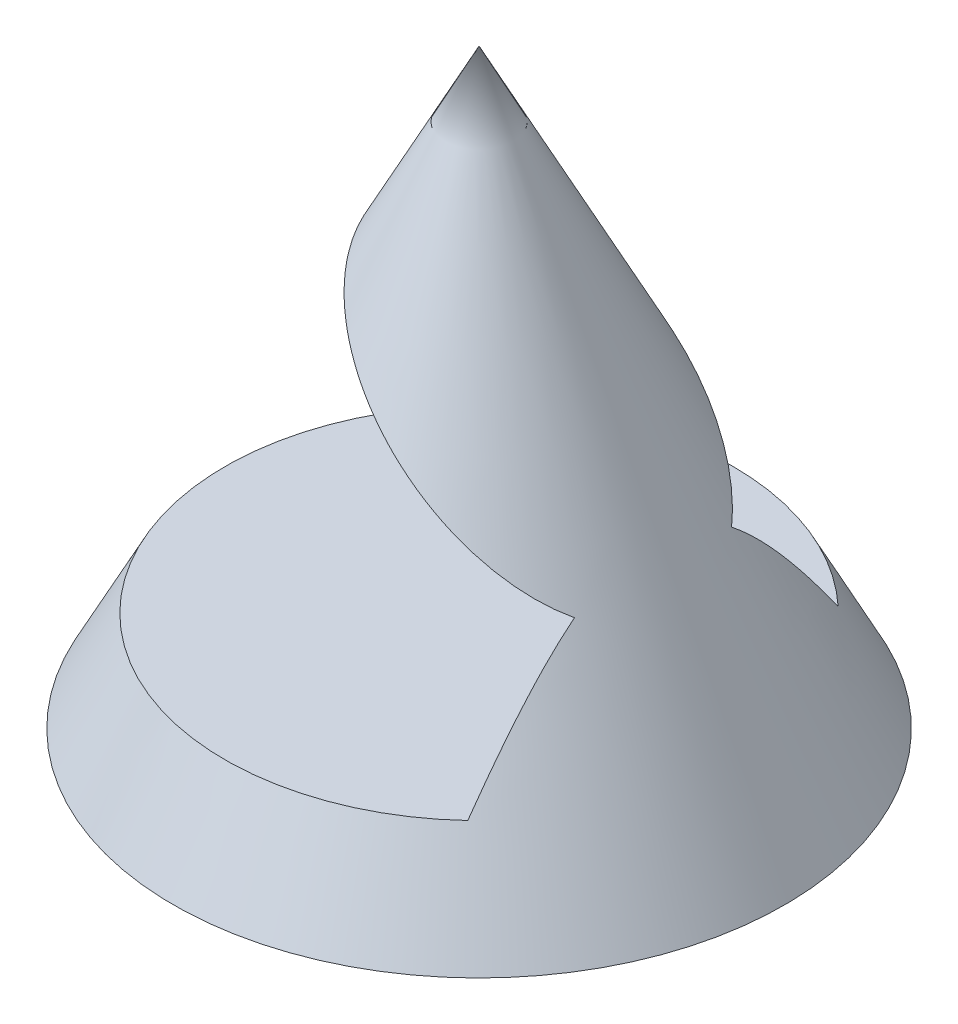
ISO-10303-21;
HEADER;
FILE_DESCRIPTION(('STEP AP214'),'2;1');
FILE_NAME('part.step','',(''),(''),'','','');
FILE_SCHEMA(('AUTOMOTIVE_DESIGN { 1 0 10303 214 1 1 1 1 }'));
ENDSEC;
DATA;
#1=APPLICATION_CONTEXT('core data for automotive mechanical design processes');
#2=APPLICATION_PROTOCOL_DEFINITION('international standard','automotive_design',2000,#1);
#3=PRODUCT_CONTEXT('',#1,'mechanical');
#4=PRODUCT('Part','Part','',(#3));
#5=PRODUCT_RELATED_PRODUCT_CATEGORY('part','',(#4));
#6=PRODUCT_DEFINITION_FORMATION('','',#4);
#7=PRODUCT_DEFINITION_CONTEXT('part definition',#1,'design');
#8=PRODUCT_DEFINITION('design','',#6,#7);
#9=PRODUCT_DEFINITION_SHAPE('','',#8);
#10=(LENGTH_UNIT() NAMED_UNIT(*) SI_UNIT(.MILLI.,.METRE.));
#11=(NAMED_UNIT(*) PLANE_ANGLE_UNIT() SI_UNIT($,.RADIAN.));
#12=(NAMED_UNIT(*) SI_UNIT($,.STERADIAN.) SOLID_ANGLE_UNIT());
#13=UNCERTAINTY_MEASURE_WITH_UNIT(LENGTH_MEASURE(1.E-05),#10,'distance_accuracy_value','');
#14=(GEOMETRIC_REPRESENTATION_CONTEXT(3) GLOBAL_UNCERTAINTY_ASSIGNED_CONTEXT((#13)) GLOBAL_UNIT_ASSIGNED_CONTEXT((#10,
#11,#12)) REPRESENTATION_CONTEXT('',''));
#15=CARTESIAN_POINT('',(0.,0.,0.));
#16=DIRECTION('',(0.,0.,1.));
#17=DIRECTION('',(1.,0.,0.));
#18=AXIS2_PLACEMENT_3D('',#15,#16,#17);
#19=CARTESIAN_POINT('',(0.,0.,0.));
#20=DIRECTION('',(0.,-1.,0.));
#21=DIRECTION('',(0.,0.,-1.));
#22=AXIS2_PLACEMENT_3D('',#19,#20,#21);
#23=CONICAL_SURFACE('',#22,15.,0.477345382373672);
#24=CARTESIAN_POINT('',(0.,29.,0.));
#25=VERTEX_POINT('',#24);
#26=VERTEX_LOOP('',#25);
#27=FACE_BOUND('',#26,.T.);
#28=CARTESIAN_POINT('',(0.,0.,0.));
#29=DIRECTION('',(0.,-1.,0.));
#30=DIRECTION('',(0.,0.,-1.));
#31=AXIS2_PLACEMENT_3D('',#28,#29,#30);
#32=CIRCLE('',#31,15.);
#33=CARTESIAN_POINT('',(0.,0.,-15.));
#34=VERTEX_POINT('',#33);
#35=EDGE_CURVE('E115',#34,#34,#32,.T.);
#36=ORIENTED_EDGE('',*,*,#35,.F.);
#37=EDGE_LOOP('',(#36));
#38=FACE_BOUND('',#37,.T.);
#39=CARTESIAN_POINT('',(8.53348056600441,-13.4586078213255,-20.2356258552981));
#40=CARTESIAN_POINT('',(8.53348056600441,-13.05966040621,-20.0116738064381));
#41=CARTESIAN_POINT('',(8.53348056600441,-12.6609508235194,-19.787298144297));
#42=CARTESIAN_POINT('',(8.53348056600441,-11.8640619759935,-19.3376052544349));
#43=CARTESIAN_POINT('',(8.53348056600441,-11.465882712237,-19.1122880248026));
#44=CARTESIAN_POINT('',(8.53348056600441,-10.2721845156053,-18.4347609725751));
#45=CARTESIAN_POINT('',(8.5334805660044,-9.47754558929341,-17.9809984468512));
#46=CARTESIAN_POINT('',(8.5334805660044,-7.88961301997016,-17.0674558174187));
#47=CARTESIAN_POINT('',(8.5334805660044,-7.09632525498491,-16.6076654853375));
#48=CARTESIAN_POINT('',(8.5334805660044,-5.51353644892241,-15.681656619156));
#49=CARTESIAN_POINT('',(8.5334805660044,-4.72403530070114,-15.2154382684031));
#50=CARTESIAN_POINT('',(8.5334805660044,-3.16196835312391,-14.2819322061547));
#51=CARTESIAN_POINT('',(8.5334805660044,-2.38932805184,-13.8147695558423));
#52=CARTESIAN_POINT('',(8.5334805660044,-1.2351740040714,-13.1061231452215));
#53=CARTESIAN_POINT('',(8.5334805660044,-0.85124022388794,-12.8685799486682));
#54=CARTESIAN_POINT('',(8.5334805660044,-0.0852816593075534,-12.3904374696865));
#55=CARTESIAN_POINT('',(8.5334805660044,0.296743137587599,-12.1498382073031));
#56=CARTESIAN_POINT('',(8.5334805660044,1.05820810948645,-11.6652788176243));
#57=CARTESIAN_POINT('',(8.5334805660044,1.4376501814203,-11.4213216743219));
#58=CARTESIAN_POINT('',(8.5334805660044,2.19380503358593,-10.9292188225121));
#59=CARTESIAN_POINT('',(8.5334805660044,2.57051785282622,-10.6810731740395));
#60=CARTESIAN_POINT('',(8.5334805660044,3.32056174189363,-10.1798258905106));
#61=CARTESIAN_POINT('',(8.5334805660044,3.69389326689394,-9.92672493746387));
#62=CARTESIAN_POINT('',(8.5334805660044,4.43641009709357,-9.41452302878426));
#63=CARTESIAN_POINT('',(8.53348056600439,4.80559557416044,-9.15542232323466));
#64=CARTESIAN_POINT('',(8.53348056600439,5.33266861810177,-8.77757461369057));
#65=CARTESIAN_POINT('',(8.53348056600439,5.49268573478393,-8.66179523927164));
#66=CARTESIAN_POINT('',(8.53348056600439,5.81158522097662,-8.42868380114913));
#67=CARTESIAN_POINT('',(8.53348056600439,5.97046758695118,-8.31135173261051));
#68=CARTESIAN_POINT('',(8.53348056600439,6.44525505395262,-7.95676969666214));
#69=CARTESIAN_POINT('',(8.53348056600439,6.75926153682737,-7.71696173032077));
#70=CARTESIAN_POINT('',(8.53348056600439,7.38361134521727,-7.2267795706655));
#71=CARTESIAN_POINT('',(8.53348056600439,7.6938944911596,-6.97632852997819));
#72=CARTESIAN_POINT('',(8.53348056600439,8.30563776989474,-6.4649332506073));
#73=CARTESIAN_POINT('',(8.53348056600439,8.60710013936827,-6.20399171254144));
#74=CARTESIAN_POINT('',(8.53348056600439,9.0525624565197,-5.80049783986084));
#75=CARTESIAN_POINT('',(8.53348056600439,9.20103917003653,-5.66288400355891));
#76=CARTESIAN_POINT('',(8.53348056600439,9.49427120958578,-5.38375441982924));
#77=CARTESIAN_POINT('',(8.53348056600439,9.63902679833706,-5.24223894933482));
#78=CARTESIAN_POINT('',(8.53348056600439,9.92429699600958,-4.95455299909006));
#79=CARTESIAN_POINT('',(8.53348056600439,10.0648047813167,-4.80837573200372));
#80=CARTESIAN_POINT('',(8.53348056600439,10.34035907064,-4.51097981488012));
#81=CARTESIAN_POINT('',(8.53348056600439,10.4754063664821,-4.35976190163131));
#82=CARTESIAN_POINT('',(8.53348056600439,10.7374149023442,-4.05320166853997));
#83=CARTESIAN_POINT('',(8.53348056600439,10.8644464418211,-3.89791972379306));
#84=CARTESIAN_POINT('',(8.53348056600439,11.1103964280339,-3.5809629871488));
#85=CARTESIAN_POINT('',(8.53348056600439,11.2293131339878,-3.41928683525196));
#86=CARTESIAN_POINT('',(8.53348056600439,11.4566139502929,-3.08931768564206));
#87=CARTESIAN_POINT('',(8.53348056600439,11.5650268855821,-2.92104468559996));
#88=CARTESIAN_POINT('',(8.53348056600439,11.7690069726093,-2.57694051182262));
#89=CARTESIAN_POINT('',(8.53348056600439,11.8645830789386,-2.40111472088106));
#90=CARTESIAN_POINT('',(8.53348056600439,12.015420972668,-2.09140505972893));
#91=CARTESIAN_POINT('',(8.53348056600439,12.0745170452163,-1.95939123812373));
#92=CARTESIAN_POINT('',(8.53348056600439,12.182910534608,-1.69135609469267));
#93=CARTESIAN_POINT('',(8.53348056600439,12.2322075876144,-1.55533462427831));
#94=CARTESIAN_POINT('',(8.53348056600439,12.3194611784987,-1.2799129055885));
#95=CARTESIAN_POINT('',(8.53348056600439,12.3574360430314,-1.14051851674717));
#96=CARTESIAN_POINT('',(8.53348056600439,12.4207832399538,-0.85890267800817));
#97=CARTESIAN_POINT('',(8.53348056600439,12.4461588603569,-0.716681975777813));
#98=CARTESIAN_POINT('',(8.53348056600439,12.4834506745952,-0.429037065900856));
#99=CARTESIAN_POINT('',(8.53348056600439,12.4952316370888,-0.283595096778628));
#100=CARTESIAN_POINT('',(8.53348056600439,12.5043337219175,0.00773953066816793));
#101=CARTESIAN_POINT('',(8.53348056600439,12.5016554423658,0.153632170101052));
#102=CARTESIAN_POINT('',(8.53348056600439,12.4819564693607,0.444587628268138));
#103=CARTESIAN_POINT('',(8.53348056600439,12.4649208689546,0.589649426686207));
#104=CARTESIAN_POINT('',(8.53348056600439,12.4172580787812,0.877513364382701));
#105=CARTESIAN_POINT('',(8.53348056600439,12.3866288147307,1.0203151553568));
#106=CARTESIAN_POINT('',(8.53348056600439,12.3071935449245,1.3249644684426));
#107=CARTESIAN_POINT('',(8.53348056600439,12.2562815584135,1.48626034366093));
#108=CARTESIAN_POINT('',(8.53348056600439,12.1401510747792,1.80363410360018));
#109=CARTESIAN_POINT('',(8.53348056600439,12.0749252225884,1.95970925800521));
#110=CARTESIAN_POINT('',(8.53348056600439,11.9323646156784,2.26650698458077));
#111=CARTESIAN_POINT('',(8.53348056600439,11.8550088574059,2.41721970543242));
#112=CARTESIAN_POINT('',(8.53348056600439,11.6903613198527,2.71305504360667));
#113=CARTESIAN_POINT('',(8.53348056600439,11.6030700477251,2.85817794575299));
#114=CARTESIAN_POINT('',(8.53348056600439,11.3983262448958,3.17743154261088));
#115=CARTESIAN_POINT('',(8.53348056600439,11.278669383785,3.35014293059723));
#116=CARTESIAN_POINT('',(8.53348056600439,11.0294298509937,3.68828506058596));
#117=CARTESIAN_POINT('',(8.53348056600439,10.8998431153841,3.85371277756848));
#118=CARTESIAN_POINT('',(8.53348056600439,10.632612901316,4.17832321892611));
#119=CARTESIAN_POINT('',(8.53348056600439,10.494957209249,4.33749583346204));
#120=CARTESIAN_POINT('',(8.53348056600439,10.2133124307284,4.65014279104208));
#121=CARTESIAN_POINT('',(8.53348056600439,10.0693225473338,4.80361641255779));
#122=CARTESIAN_POINT('',(8.53348056600439,9.77525070188436,5.10654939826336));
#123=CARTESIAN_POINT('',(8.53348056600439,9.62513505242564,5.25597593933596));
#124=CARTESIAN_POINT('',(8.53348056600439,9.32062658114464,5.55039949437481));
#125=CARTESIAN_POINT('',(8.53348056600439,9.16623364323636,5.69539638789501));
#126=CARTESIAN_POINT('',(8.53348056600439,8.85406007762875,5.98135104870962));
#127=CARTESIAN_POINT('',(8.53348056600439,8.69628320703577,6.12231292720447));
#128=CARTESIAN_POINT('',(8.53348056600439,8.37775106290222,6.4008092548294));
#129=CARTESIAN_POINT('',(8.53348056600439,8.21699589563691,6.53834382584781));
#130=CARTESIAN_POINT('',(8.53348056600439,7.70000814587899,6.9724125402845));
#131=CARTESIAN_POINT('',(8.53348056600439,7.33897657746886,7.26323717349352));
#132=CARTESIAN_POINT('',(8.53348056600439,6.60817893571383,7.83373402949235));
#133=CARTESIAN_POINT('',(8.53348056600439,6.23841129589615,8.11340422762878));
#134=CARTESIAN_POINT('',(8.53348056600439,5.49211777723225,8.66404117310498));
#135=CARTESIAN_POINT('',(8.53348056600439,5.1155878786556,8.93500245735227));
#136=CARTESIAN_POINT('',(8.53348056600439,4.35751806362202,9.46974535576851));
#137=CARTESIAN_POINT('',(8.5334805660044,3.97597848088894,9.73352744462377));
#138=CARTESIAN_POINT('',(8.5334805660044,3.20806639153807,10.2558078235198));
#139=CARTESIAN_POINT('',(8.5334805660044,2.82168502413415,10.5142930586568));
#140=CARTESIAN_POINT('',(8.5334805660044,2.04569649091231,11.0263786069552));
#141=CARTESIAN_POINT('',(8.5334805660044,1.6560892793762,11.2799788507142));
#142=CARTESIAN_POINT('',(8.5334805660044,0.874372119393789,11.7829869160319));
#143=CARTESIAN_POINT('',(8.5334805660044,0.482263085186727,12.0323961601992));
#144=CARTESIAN_POINT('',(8.5334805660044,-0.304152165765548,12.5277289356305));
#145=CARTESIAN_POINT('',(8.5334805660044,-0.698458400777123,12.7736524378555));
#146=CARTESIAN_POINT('',(8.5334805660044,-1.88297562510383,13.5062497671095));
#147=CARTESIAN_POINT('',(8.5334805660044,-2.67593267971954,13.9884842089968));
#148=CARTESIAN_POINT('',(8.5334805660044,-4.26723486726507,14.9440898328397));
#149=CARTESIAN_POINT('',(8.5334805660044,-5.06558041760688,15.4174603171883));
#150=CARTESIAN_POINT('',(8.5334805660044,-6.66549937403835,16.3568221592034));
#151=CARTESIAN_POINT('',(8.5334805660044,-7.4670686482032,16.8228205628501));
#152=CARTESIAN_POINT('',(8.5334805660044,-9.07334573825611,17.749374699948));
#153=CARTESIAN_POINT('',(8.53348056600441,-9.87805356140141,18.2099304208042));
#154=CARTESIAN_POINT('',(8.53348056600441,-10.9149052840259,18.799605001122));
#155=CARTESIAN_POINT('',(8.53348056600441,-11.145904940579,18.9307398482102));
#156=CARTESIAN_POINT('',(8.53348056600441,-11.6081210080959,19.1926813733562));
#157=CARTESIAN_POINT('',(8.53348056600441,-11.839337438511,19.3234880171074));
#158=CARTESIAN_POINT('',(8.53348056600441,-12.3018090082146,19.5846988115494));
#159=CARTESIAN_POINT('',(8.53348056600441,-12.5330640352391,19.7151031610486));
#160=CARTESIAN_POINT('',(8.53348056600441,-12.9957218549431,19.9755947009878));
#161=CARTESIAN_POINT('',(8.53348056600441,-13.2271246303149,20.105681922167));
#162=CARTESIAN_POINT('',(8.53348056600441,-13.4586078213255,20.2356258552981));
#163=B_SPLINE_CURVE_WITH_KNOTS('',3,(#39,#40,#41,#42,#43,#44,#45,#46,#47,#48,#49,#50,#51,#52,
#53,#54,#55,#56,#57,#58,#59,#60,#61,#62,#63,#64,#65,#66,#67,#68,#69,#70,#71,#72,#73,#74,#75,#76,
#77,#78,#79,#80,#81,#82,#83,#84,#85,#86,#87,#88,#89,#90,#91,#92,#93,#94,#95,#96,#97,#98,#99,
#100,#101,#102,#103,#104,#105,#106,#107,#108,#109,#110,#111,#112,#113,#114,#115,#116,#117,#118,
#119,#120,#121,#122,#123,#124,#125,#126,#127,#128,#129,#130,#131,#132,#133,#134,#135,#136,#137,
#138,#139,#140,#141,#142,#143,#144,#145,#146,#147,#148,#149,#150,#151,#152,#153,#154,#155,#156,
#157,#158,#159,#160,#161,#162),.UNSPECIFIED.,.F.,.F.,(4,2,2,2,2,2,2,2,2,2,2,2,2,2,2,2,2,2,2,2,2,
2,2,2,2,2,2,2,2,2,2,2,2,2,2,2,2,2,2,2,2,2,2,2,2,2,2,2,2,2,2,2,2,2,2,2,2,2,2,2,2,4),(0.,
1.37252350783083,2.74504980325729,5.49024138710343,8.24092875531117,10.9915378268912,
13.7001410444042,15.0545621619727,16.4089744004153,17.7622521348072,19.1155104888313,
20.4685838823033,21.8216009777668,22.4141237732038,23.006648414177,24.1918413758044,
25.3879256820968,26.5837040221691,27.1909742529683,27.798201490859,28.406357275193,
29.0144245522107,29.6160740867716,30.2178522831766,30.8179292731161,31.4175854686232,
31.8511690829802,32.2847687932621,32.7176627989774,33.1504437732747,33.5874936540923,
34.0245254562812,34.4620115806934,34.8995644849178,35.4061830519403,35.9130625530325,
36.4208296362881,36.9285708124517,37.558445342759,38.1885790484817,38.819692506524,
39.4508855969489,40.0862072731794,40.7215462090224,41.3562129376847,41.9908570628353,
43.381316511713,44.7720272063194,46.1635939092078,47.5550683774736,48.9496372743402,
50.3442259696505,51.7383313073044,53.1324482521542,55.9165963168925,58.7009625851177,
61.4824836910657,64.2640112325254,65.060889243172,65.8578473425788,66.6543128363991,
67.4506977878692),.UNSPECIFIED.);
#164=CARTESIAN_POINT('',(8.53348056600439,4.89806242760849,-9.08811400829762));
#165=VERTEX_POINT('',#164);
#166=CARTESIAN_POINT('',(8.53348056600439,10.8980624276085,-3.8531559716546));
#167=VERTEX_POINT('',#166);
#168=EDGE_CURVE('E12',#165,#167,#163,.T.);
#169=ORIENTED_EDGE('',*,*,#168,.T.);
#170=CARTESIAN_POINT('',(2.90363701409953,15.3863017727409,0.));
#171=DIRECTION('',(-0.623369997775086,-0.781927008021778,0.));
#172=DIRECTION('',(0.781927008021778,-0.623369997775086,0.));
#173=AXIS2_PLACEMENT_3D('',#170,#171,#172);
#174=ELLIPSE('',#173,9.0054032874462,6.41502709839687);
#175=CARTESIAN_POINT('',(8.53348056600439,10.8980624276085,3.8531559716546));
#176=VERTEX_POINT('',#175);
#177=EDGE_CURVE('E111',#167,#176,#174,.F.);
#178=ORIENTED_EDGE('',*,*,#177,.T.);
#179=CARTESIAN_POINT('',(8.53348056600439,4.89806242760849,9.08811400829762));
#180=VERTEX_POINT('',#179);
#181=EDGE_CURVE('E92',#176,#180,#163,.T.);
#182=ORIENTED_EDGE('',*,*,#181,.T.);
#183=CARTESIAN_POINT('',(0.,4.89806242760849,0.));
#184=DIRECTION('',(0.,1.,0.));
#185=DIRECTION('',(-1.,0.,0.));
#186=AXIS2_PLACEMENT_3D('',#183,#184,#185);
#187=CIRCLE('',#186,12.4665194339956);
#188=EDGE_CURVE('E87',#180,#165,#187,.F.);
#189=ORIENTED_EDGE('',*,*,#188,.T.);
#190=EDGE_LOOP('',(#169,#178,#182,#189));
#191=FACE_BOUND('',#190,.T.);
#192=ADVANCED_FACE('F83',(#27,#38,#191),#23,.T.);
#193=CARTESIAN_POINT('',(15.,0.,0.));
#194=DIRECTION('',(0.,-1.,0.));
#195=DIRECTION('',(0.,0.,-1.));
#196=AXIS2_PLACEMENT_3D('',#193,#194,#195);
#197=PLANE('',#196);
#198=ORIENTED_EDGE('',*,*,#35,.T.);
#199=EDGE_LOOP('',(#198));
#200=FACE_BOUND('',#199,.T.);
#201=ADVANCED_FACE('F85',(#200),#197,.T.);
#202=CARTESIAN_POINT('',(0.,4.89806242760849,-15.));
#203=DIRECTION('',(0.,1.,0.));
#204=DIRECTION('',(-1.,0.,0.));
#205=AXIS2_PLACEMENT_3D('',#202,#203,#204);
#206=PLANE('',#205);
#207=ORIENTED_EDGE('',*,*,#188,.F.);
#208=DIRECTION('',(0.,0.,1.));
#209=VECTOR('',#208,1.);
#210=CARTESIAN_POINT('',(8.53348056600439,4.89806242760849,-15.));
#211=LINE('',#210,#209);
#212=EDGE_CURVE('E122',#165,#180,#211,.T.);
#213=ORIENTED_EDGE('',*,*,#212,.F.);
#214=EDGE_LOOP('',(#207,#213));
#215=FACE_BOUND('',#214,.T.);
#216=ADVANCED_FACE('F136',(#215),#206,.T.);
#217=CARTESIAN_POINT('',(8.5334805660044,0.,-15.));
#218=DIRECTION('',(-1.,0.,0.));
#219=DIRECTION('',(0.,-1.,0.));
#220=AXIS2_PLACEMENT_3D('',#217,#218,#219);
#221=PLANE('',#220);
#222=ORIENTED_EDGE('',*,*,#212,.T.);
#223=ORIENTED_EDGE('',*,*,#181,.F.);
#224=DIRECTION('',(0.,0.,1.));
#225=VECTOR('',#224,1.);
#226=CARTESIAN_POINT('',(8.53348056600439,10.8980624276085,-15.));
#227=LINE('',#226,#225);
#228=EDGE_CURVE('E98',#167,#176,#227,.T.);
#229=ORIENTED_EDGE('',*,*,#228,.F.);
#230=ORIENTED_EDGE('',*,*,#168,.F.);
#231=EDGE_LOOP('',(#222,#223,#229,#230));
#232=FACE_BOUND('',#231,.T.);
#233=ADVANCED_FACE('F120',(#232),#221,.T.);
#234=CARTESIAN_POINT('',(8.62806732381425,10.8226557126586,-15.));
#235=DIRECTION('',(-0.623369997775086,-0.781927008021778,0.));
#236=DIRECTION('',(0.781927008021778,-0.623369997775086,0.));
#237=AXIS2_PLACEMENT_3D('',#234,#235,#236);
#238=PLANE('',#237);
#239=ORIENTED_EDGE('',*,*,#228,.T.);
#240=ORIENTED_EDGE('',*,*,#177,.F.);
#241=EDGE_LOOP('',(#239,#240));
#242=FACE_BOUND('',#241,.T.);
#243=ADVANCED_FACE('F112',(#242),#238,.T.);
#244=CLOSED_SHELL('',(#192,#201,#216,#233,#243));
#245=MANIFOLD_SOLID_BREP('B2',#244);
#246=ADVANCED_BREP_SHAPE_REPRESENTATION('',(#18,#245),#14);
#247=SHAPE_DEFINITION_REPRESENTATION(#9,#246);
ENDSEC;
END-ISO-10303-21;
